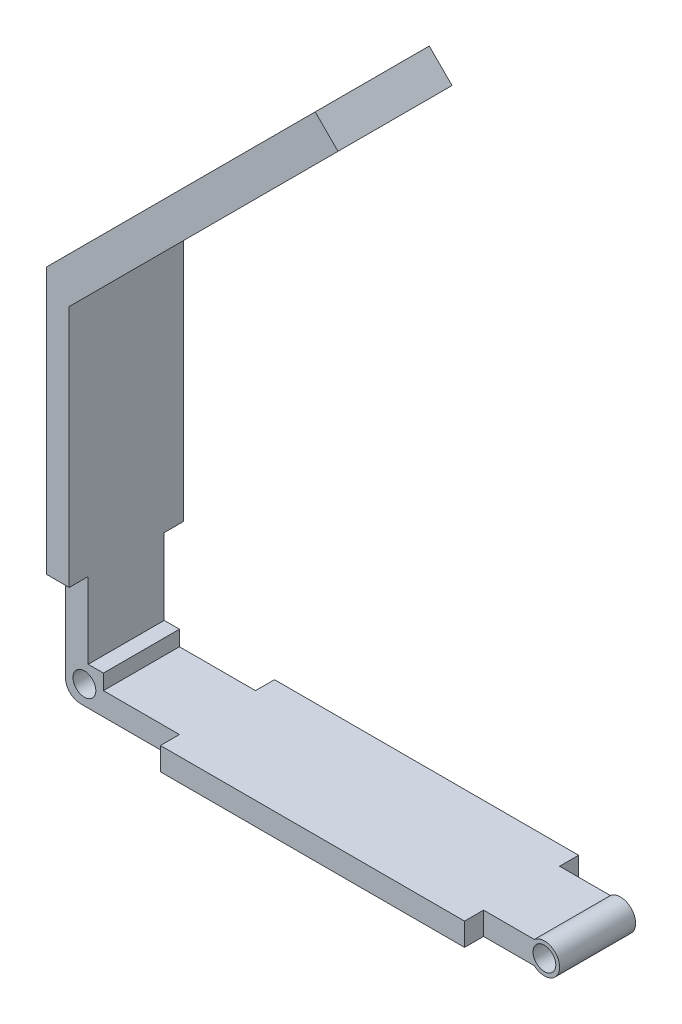
ISO-10303-21;
HEADER;
FILE_DESCRIPTION(('STEP AP214'),'2;1');
FILE_NAME('part.step','',(''),(''),'','','');
FILE_SCHEMA(('AUTOMOTIVE_DESIGN { 1 0 10303 214 1 1 1 1 }'));
ENDSEC;
DATA;
#1=APPLICATION_CONTEXT('core data for automotive mechanical design processes');
#2=APPLICATION_PROTOCOL_DEFINITION('international standard','automotive_design',2000,#1);
#3=PRODUCT_CONTEXT('',#1,'mechanical');
#4=PRODUCT('Part','Part','',(#3));
#5=PRODUCT_RELATED_PRODUCT_CATEGORY('part','',(#4));
#6=PRODUCT_DEFINITION_FORMATION('','',#4);
#7=PRODUCT_DEFINITION_CONTEXT('part definition',#1,'design');
#8=PRODUCT_DEFINITION('design','',#6,#7);
#9=PRODUCT_DEFINITION_SHAPE('','',#8);
#10=(LENGTH_UNIT() NAMED_UNIT(*) SI_UNIT(.MILLI.,.METRE.));
#11=(NAMED_UNIT(*) PLANE_ANGLE_UNIT() SI_UNIT($,.RADIAN.));
#12=(NAMED_UNIT(*) SI_UNIT($,.STERADIAN.) SOLID_ANGLE_UNIT());
#13=UNCERTAINTY_MEASURE_WITH_UNIT(LENGTH_MEASURE(1.E-05),#10,'distance_accuracy_value','');
#14=(GEOMETRIC_REPRESENTATION_CONTEXT(3) GLOBAL_UNCERTAINTY_ASSIGNED_CONTEXT((#13)) GLOBAL_UNIT_ASSIGNED_CONTEXT((#10,
#11,#12)) REPRESENTATION_CONTEXT('',''));
#15=CARTESIAN_POINT('',(0.,0.,0.));
#16=DIRECTION('',(0.,0.,1.));
#17=DIRECTION('',(1.,0.,0.));
#18=AXIS2_PLACEMENT_3D('',#15,#16,#17);
#19=CARTESIAN_POINT('',(0.,0.,0.));
#20=DIRECTION('',(1.,0.,0.));
#21=DIRECTION('',(0.,0.,-1.));
#22=AXIS2_PLACEMENT_3D('',#19,#20,#21);
#23=PLANE('',#22);
#24=DIRECTION('',(0.,-1.,0.));
#25=VECTOR('',#24,1.);
#26=CARTESIAN_POINT('',(0.,0.,-15.));
#27=LINE('',#26,#25);
#28=CARTESIAN_POINT('',(0.,47.,-15.));
#29=VERTEX_POINT('',#28);
#30=CARTESIAN_POINT('',(0.,15.,-15.));
#31=VERTEX_POINT('',#30);
#32=EDGE_CURVE('E402',#29,#31,#27,.T.);
#33=ORIENTED_EDGE('',*,*,#32,.F.);
#34=DIRECTION('',(0.,0.,-1.));
#35=VECTOR('',#34,1.);
#36=CARTESIAN_POINT('',(0.,47.,-15.));
#37=LINE('',#36,#35);
#38=CARTESIAN_POINT('',(0.,47.,0.));
#39=VERTEX_POINT('',#38);
#40=EDGE_CURVE('E218',#39,#29,#37,.T.);
#41=ORIENTED_EDGE('',*,*,#40,.F.);
#42=DIRECTION('',(0.,1.,0.));
#43=VECTOR('',#42,1.);
#44=CARTESIAN_POINT('',(0.,0.,0.));
#45=LINE('',#44,#43);
#46=CARTESIAN_POINT('',(0.,15.,0.));
#47=VERTEX_POINT('',#46);
#48=EDGE_CURVE('E408',#47,#39,#45,.T.);
#49=ORIENTED_EDGE('',*,*,#48,.F.);
#50=DIRECTION('',(0.,0.,-1.));
#51=VECTOR('',#50,1.);
#52=CARTESIAN_POINT('',(0.,15.,0.));
#53=LINE('',#52,#51);
#54=CARTESIAN_POINT('',(0.,15.,-2.5));
#55=VERTEX_POINT('',#54);
#56=EDGE_CURVE('E329',#47,#55,#53,.T.);
#57=ORIENTED_EDGE('',*,*,#56,.T.);
#58=DIRECTION('',(0.,-1.,0.));
#59=VECTOR('',#58,1.);
#60=CARTESIAN_POINT('',(0.,0.,-2.5));
#61=LINE('',#60,#59);
#62=CARTESIAN_POINT('',(0.,5.,-2.5));
#63=VERTEX_POINT('',#62);
#64=EDGE_CURVE('E304',#55,#63,#61,.T.);
#65=ORIENTED_EDGE('',*,*,#64,.T.);
#66=DIRECTION('',(0.,0.,1.));
#67=VECTOR('',#66,1.);
#68=CARTESIAN_POINT('',(0.,5.,0.));
#69=LINE('',#68,#67);
#70=CARTESIAN_POINT('',(0.,5.,-12.5));
#71=VERTEX_POINT('',#70);
#72=EDGE_CURVE('E394',#71,#63,#69,.T.);
#73=ORIENTED_EDGE('',*,*,#72,.F.);
#74=DIRECTION('',(0.,1.,0.));
#75=VECTOR('',#74,1.);
#76=CARTESIAN_POINT('',(0.,0.,-12.5));
#77=LINE('',#76,#75);
#78=CARTESIAN_POINT('',(0.,15.,-12.5));
#79=VERTEX_POINT('',#78);
#80=EDGE_CURVE('E377',#71,#79,#77,.T.);
#81=ORIENTED_EDGE('',*,*,#80,.T.);
#82=DIRECTION('',(0.,0.,1.));
#83=VECTOR('',#82,1.);
#84=CARTESIAN_POINT('',(0.,15.,0.));
#85=LINE('',#84,#83);
#86=EDGE_CURVE('E384',#31,#79,#85,.T.);
#87=ORIENTED_EDGE('',*,*,#86,.F.);
#88=EDGE_LOOP('',(#33,#41,#49,#57,#65,#73,#81,#87));
#89=FACE_BOUND('',#88,.T.);
#90=ADVANCED_FACE('F39',(#89),#23,.T.);
#91=CARTESIAN_POINT('',(60.,1.5,5.65685424949239));
#92=DIRECTION('',(0.,0.,-1.));
#93=DIRECTION('',(-1.,0.,0.));
#94=AXIS2_PLACEMENT_3D('',#91,#92,#93);
#95=CYLINDRICAL_SURFACE('',#94,2.);
#96=CARTESIAN_POINT('',(60.,1.5,-2.5));
#97=DIRECTION('',(0.,0.,1.));
#98=DIRECTION('',(1.,0.,0.));
#99=AXIS2_PLACEMENT_3D('',#96,#97,#98);
#100=CIRCLE('',#99,2.);
#101=CARTESIAN_POINT('',(58.6771243444677,3.,-2.5));
#102=VERTEX_POINT('',#101);
#103=CARTESIAN_POINT('',(58.6771243444677,0.,-2.5));
#104=VERTEX_POINT('',#103);
#105=EDGE_CURVE('E236',#102,#104,#100,.F.);
#106=ORIENTED_EDGE('',*,*,#105,.T.);
#107=DIRECTION('',(0.,0.,-1.));
#108=VECTOR('',#107,1.);
#109=CARTESIAN_POINT('',(58.6771243444677,0.,5.65685424949239));
#110=LINE('',#109,#108);
#111=CARTESIAN_POINT('',(58.6771243444677,0.,-12.5));
#112=VERTEX_POINT('',#111);
#113=EDGE_CURVE('E277',#104,#112,#110,.T.);
#114=ORIENTED_EDGE('',*,*,#113,.T.);
#115=CARTESIAN_POINT('',(60.,1.5,-12.5));
#116=DIRECTION('',(0.,0.,-1.));
#117=DIRECTION('',(-1.,0.,0.));
#118=AXIS2_PLACEMENT_3D('',#115,#116,#117);
#119=CIRCLE('',#118,2.);
#120=CARTESIAN_POINT('',(58.6771243444677,3.,-12.5));
#121=VERTEX_POINT('',#120);
#122=EDGE_CURVE('E258',#112,#121,#119,.F.);
#123=ORIENTED_EDGE('',*,*,#122,.T.);
#124=DIRECTION('',(0.,0.,-1.));
#125=VECTOR('',#124,1.);
#126=CARTESIAN_POINT('',(58.6771243444677,3.,5.65685424949239));
#127=LINE('',#126,#125);
#128=EDGE_CURVE('E280',#102,#121,#127,.T.);
#129=ORIENTED_EDGE('',*,*,#128,.F.);
#130=EDGE_LOOP('',(#106,#114,#123,#129));
#131=FACE_BOUND('',#130,.T.);
#132=ADVANCED_FACE('F462',(#131),#95,.T.);
#133=CARTESIAN_POINT('',(60.,1.5,0.));
#134=DIRECTION('',(0.,0.,-1.));
#135=DIRECTION('',(-1.,0.,0.));
#136=AXIS2_PLACEMENT_3D('',#133,#134,#135);
#137=CYLINDRICAL_SURFACE('',#136,1.5);
#138=CARTESIAN_POINT('',(60.,1.5,-12.5));
#139=DIRECTION('',(0.,0.,-1.));
#140=DIRECTION('',(-1.,0.,0.));
#141=AXIS2_PLACEMENT_3D('',#138,#139,#140);
#142=CIRCLE('',#141,1.5);
#143=CARTESIAN_POINT('',(58.5,1.5,-12.5));
#144=VERTEX_POINT('',#143);
#145=EDGE_CURVE('E255',#144,#144,#142,.F.);
#146=ORIENTED_EDGE('',*,*,#145,.F.);
#147=EDGE_LOOP('',(#146));
#148=FACE_BOUND('',#147,.T.);
#149=CARTESIAN_POINT('',(60.,1.5,-2.5));
#150=DIRECTION('',(0.,0.,1.));
#151=DIRECTION('',(1.,0.,0.));
#152=AXIS2_PLACEMENT_3D('',#149,#150,#151);
#153=CIRCLE('',#152,1.5);
#154=CARTESIAN_POINT('',(61.5,1.5,-2.5));
#155=VERTEX_POINT('',#154);
#156=EDGE_CURVE('E243',#155,#155,#153,.F.);
#157=ORIENTED_EDGE('',*,*,#156,.F.);
#158=EDGE_LOOP('',(#157));
#159=FACE_BOUND('',#158,.T.);
#160=ADVANCED_FACE('F540',(#148,#159),#137,.F.);
#161=CARTESIAN_POINT('',(0.,3.,0.));
#162=DIRECTION('',(0.,0.,-1.));
#163=DIRECTION('',(-1.,0.,0.));
#164=AXIS2_PLACEMENT_3D('',#161,#162,#163);
#165=PLANE('',#164);
#166=DIRECTION('',(0.,1.,0.));
#167=VECTOR('',#166,1.);
#168=CARTESIAN_POINT('',(52.,3.50000000000001,0.));
#169=LINE('',#168,#167);
#170=CARTESIAN_POINT('',(52.,0.,0.));
#171=VERTEX_POINT('',#170);
#172=CARTESIAN_POINT('',(52.,3.,0.));
#173=VERTEX_POINT('',#172);
#174=EDGE_CURVE('E225',#171,#173,#169,.T.);
#175=ORIENTED_EDGE('',*,*,#174,.T.);
#176=DIRECTION('',(1.,0.,0.));
#177=VECTOR('',#176,1.);
#178=CARTESIAN_POINT('',(0.,3.,0.));
#179=LINE('',#178,#177);
#180=CARTESIAN_POINT('',(12.,3.,0.));
#181=VERTEX_POINT('',#180);
#182=EDGE_CURVE('E418',#181,#173,#179,.T.);
#183=ORIENTED_EDGE('',*,*,#182,.F.);
#184=DIRECTION('',(0.,-1.,0.));
#185=VECTOR('',#184,1.);
#186=CARTESIAN_POINT('',(12.,0.,0.));
#187=LINE('',#186,#185);
#188=CARTESIAN_POINT('',(12.,0.,0.));
#189=VERTEX_POINT('',#188);
#190=EDGE_CURVE('E283',#181,#189,#187,.T.);
#191=ORIENTED_EDGE('',*,*,#190,.T.);
#192=DIRECTION('',(1.,0.,0.));
#193=VECTOR('',#192,1.);
#194=CARTESIAN_POINT('',(0.,0.,0.));
#195=LINE('',#194,#193);
#196=EDGE_CURVE('E413',#189,#171,#195,.T.);
#197=ORIENTED_EDGE('',*,*,#196,.T.);
#198=EDGE_LOOP('',(#175,#183,#191,#197));
#199=FACE_BOUND('',#198,.T.);
#200=ADVANCED_FACE('F520',(#199),#165,.F.);
#201=CARTESIAN_POINT('',(0.,3.,0.));
#202=DIRECTION('',(0.,-1.,0.));
#203=DIRECTION('',(0.,0.,-1.));
#204=AXIS2_PLACEMENT_3D('',#201,#202,#203);
#205=PLANE('',#204);
#206=DIRECTION('',(0.,0.,1.));
#207=VECTOR('',#206,1.);
#208=CARTESIAN_POINT('',(52.,3.,0.));
#209=LINE('',#208,#207);
#210=CARTESIAN_POINT('',(52.,3.,-2.5));
#211=VERTEX_POINT('',#210);
#212=EDGE_CURVE('E247',#211,#173,#209,.T.);
#213=ORIENTED_EDGE('',*,*,#212,.F.);
#214=DIRECTION('',(-1.,0.,0.));
#215=VECTOR('',#214,1.);
#216=CARTESIAN_POINT('',(0.,3.,-2.5));
#217=LINE('',#216,#215);
#218=EDGE_CURVE('E240',#102,#211,#217,.T.);
#219=ORIENTED_EDGE('',*,*,#218,.F.);
#220=ORIENTED_EDGE('',*,*,#128,.T.);
#221=DIRECTION('',(1.,0.,0.));
#222=VECTOR('',#221,1.);
#223=CARTESIAN_POINT('',(0.,3.,-12.5));
#224=LINE('',#223,#222);
#225=CARTESIAN_POINT('',(52.,3.,-12.5));
#226=VERTEX_POINT('',#225);
#227=EDGE_CURVE('E266',#226,#121,#224,.T.);
#228=ORIENTED_EDGE('',*,*,#227,.F.);
#229=DIRECTION('',(0.,0.,-1.));
#230=VECTOR('',#229,1.);
#231=CARTESIAN_POINT('',(52.,3.,0.));
#232=LINE('',#231,#230);
#233=CARTESIAN_POINT('',(52.,3.,-15.));
#234=VERTEX_POINT('',#233);
#235=EDGE_CURVE('E273',#226,#234,#232,.T.);
#236=ORIENTED_EDGE('',*,*,#235,.T.);
#237=DIRECTION('',(-1.,0.,0.));
#238=VECTOR('',#237,1.);
#239=CARTESIAN_POINT('',(0.,3.,-15.));
#240=LINE('',#239,#238);
#241=CARTESIAN_POINT('',(12.,3.,-15.));
#242=VERTEX_POINT('',#241);
#243=EDGE_CURVE('E422',#234,#242,#240,.T.);
#244=ORIENTED_EDGE('',*,*,#243,.T.);
#245=DIRECTION('',(0.,0.,1.));
#246=VECTOR('',#245,1.);
#247=CARTESIAN_POINT('',(12.,3.,0.));
#248=LINE('',#247,#246);
#249=CARTESIAN_POINT('',(12.,3.,-12.5));
#250=VERTEX_POINT('',#249);
#251=EDGE_CURVE('E387',#242,#250,#248,.T.);
#252=ORIENTED_EDGE('',*,*,#251,.T.);
#253=DIRECTION('',(1.,0.,0.));
#254=VECTOR('',#253,1.);
#255=CARTESIAN_POINT('',(0.,3.,-12.5));
#256=LINE('',#255,#254);
#257=CARTESIAN_POINT('',(2.,3.,-12.5));
#258=VERTEX_POINT('',#257);
#259=EDGE_CURVE('E381',#258,#250,#256,.T.);
#260=ORIENTED_EDGE('',*,*,#259,.F.);
#261=DIRECTION('',(0.,0.,1.));
#262=VECTOR('',#261,1.);
#263=CARTESIAN_POINT('',(2.,3.,0.));
#264=LINE('',#263,#262);
#265=CARTESIAN_POINT('',(2.,3.,-2.5));
#266=VERTEX_POINT('',#265);
#267=EDGE_CURVE('E398',#258,#266,#264,.T.);
#268=ORIENTED_EDGE('',*,*,#267,.T.);
#269=DIRECTION('',(-1.,0.,0.));
#270=VECTOR('',#269,1.);
#271=CARTESIAN_POINT('',(0.,3.,-2.5));
#272=LINE('',#271,#270);
#273=CARTESIAN_POINT('',(12.,3.,-2.5));
#274=VERTEX_POINT('',#273);
#275=EDGE_CURVE('E318',#274,#266,#272,.T.);
#276=ORIENTED_EDGE('',*,*,#275,.F.);
#277=DIRECTION('',(0.,0.,-1.));
#278=VECTOR('',#277,1.);
#279=CARTESIAN_POINT('',(12.,3.,0.));
#280=LINE('',#279,#278);
#281=EDGE_CURVE('E333',#181,#274,#280,.T.);
#282=ORIENTED_EDGE('',*,*,#281,.F.);
#283=ORIENTED_EDGE('',*,*,#182,.T.);
#284=EDGE_LOOP('',(#213,#219,#220,#228,#236,#244,#252,#260,#268,#276,#282,#283));
#285=FACE_BOUND('',#284,.T.);
#286=ADVANCED_FACE('F460',(#285),#205,.F.);
#287=CARTESIAN_POINT('',(0.,0.,0.));
#288=DIRECTION('',(0.,-1.,0.));
#289=DIRECTION('',(0.,0.,-1.));
#290=AXIS2_PLACEMENT_3D('',#287,#288,#289);
#291=PLANE('',#290);
#292=DIRECTION('',(-1.,0.,0.));
#293=VECTOR('',#292,1.);
#294=CARTESIAN_POINT('',(0.,0.,-2.5));
#295=LINE('',#294,#293);
#296=CARTESIAN_POINT('',(52.,0.,-2.5));
#297=VERTEX_POINT('',#296);
#298=EDGE_CURVE('E48',#104,#297,#295,.T.);
#299=ORIENTED_EDGE('',*,*,#298,.T.);
#300=DIRECTION('',(0.,0.,1.));
#301=VECTOR('',#300,1.);
#302=CARTESIAN_POINT('',(52.,0.,0.));
#303=LINE('',#302,#301);
#304=EDGE_CURVE('E11',#297,#171,#303,.T.);
#305=ORIENTED_EDGE('',*,*,#304,.T.);
#306=ORIENTED_EDGE('',*,*,#196,.F.);
#307=DIRECTION('',(0.,0.,1.));
#308=VECTOR('',#307,1.);
#309=CARTESIAN_POINT('',(12.,0.,-2.5));
#310=LINE('',#309,#308);
#311=CARTESIAN_POINT('',(12.,0.,-2.5));
#312=VERTEX_POINT('',#311);
#313=EDGE_CURVE('E295',#312,#189,#310,.T.);
#314=ORIENTED_EDGE('',*,*,#313,.F.);
#315=DIRECTION('',(-1.,0.,0.));
#316=VECTOR('',#315,1.);
#317=CARTESIAN_POINT('',(-3.,0.,-2.5));
#318=LINE('',#317,#316);
#319=CARTESIAN_POINT('',(-1.,0.,-2.5));
#320=VERTEX_POINT('',#319);
#321=EDGE_CURVE('E284',#312,#320,#318,.T.);
#322=ORIENTED_EDGE('',*,*,#321,.T.);
#323=DIRECTION('',(0.,0.,1.));
#324=VECTOR('',#323,1.);
#325=CARTESIAN_POINT('',(-1.,0.,-15.));
#326=LINE('',#325,#324);
#327=CARTESIAN_POINT('',(-1.,0.,-12.5));
#328=VERTEX_POINT('',#327);
#329=EDGE_CURVE('E435',#320,#328,#326,.F.);
#330=ORIENTED_EDGE('',*,*,#329,.T.);
#331=DIRECTION('',(-1.,0.,0.));
#332=VECTOR('',#331,1.);
#333=CARTESIAN_POINT('',(-3.,0.,-12.5));
#334=LINE('',#333,#332);
#335=CARTESIAN_POINT('',(12.,0.,-12.5));
#336=VERTEX_POINT('',#335);
#337=EDGE_CURVE('E348',#336,#328,#334,.T.);
#338=ORIENTED_EDGE('',*,*,#337,.F.);
#339=DIRECTION('',(0.,0.,-1.));
#340=VECTOR('',#339,1.);
#341=CARTESIAN_POINT('',(12.,0.,-12.5));
#342=LINE('',#341,#340);
#343=CARTESIAN_POINT('',(12.,0.,-15.));
#344=VERTEX_POINT('',#343);
#345=EDGE_CURVE('E359',#336,#344,#342,.T.);
#346=ORIENTED_EDGE('',*,*,#345,.T.);
#347=DIRECTION('',(-1.,0.,0.));
#348=VECTOR('',#347,1.);
#349=CARTESIAN_POINT('',(0.,0.,-15.));
#350=LINE('',#349,#348);
#351=CARTESIAN_POINT('',(52.,0.,-15.));
#352=VERTEX_POINT('',#351);
#353=EDGE_CURVE('E423',#352,#344,#350,.T.);
#354=ORIENTED_EDGE('',*,*,#353,.F.);
#355=DIRECTION('',(0.,0.,-1.));
#356=VECTOR('',#355,1.);
#357=CARTESIAN_POINT('',(52.,0.,0.));
#358=LINE('',#357,#356);
#359=CARTESIAN_POINT('',(52.,0.,-12.5));
#360=VERTEX_POINT('',#359);
#361=EDGE_CURVE('E270',#360,#352,#358,.T.);
#362=ORIENTED_EDGE('',*,*,#361,.F.);
#363=DIRECTION('',(1.,0.,0.));
#364=VECTOR('',#363,1.);
#365=CARTESIAN_POINT('',(0.,0.,-12.5));
#366=LINE('',#365,#364);
#367=EDGE_CURVE('E262',#360,#112,#366,.T.);
#368=ORIENTED_EDGE('',*,*,#367,.T.);
#369=ORIENTED_EDGE('',*,*,#113,.F.);
#370=EDGE_LOOP('',(#299,#305,#306,#314,#322,#330,#338,#346,#354,#362,#368,#369));
#371=FACE_BOUND('',#370,.T.);
#372=ADVANCED_FACE('F451',(#371),#291,.T.);
#373=CARTESIAN_POINT('',(2.,0.,0.));
#374=DIRECTION('',(1.,0.,0.));
#375=DIRECTION('',(0.,0.,-1.));
#376=AXIS2_PLACEMENT_3D('',#373,#374,#375);
#377=PLANE('',#376);
#378=DIRECTION('',(0.,0.,-1.));
#379=VECTOR('',#378,1.);
#380=CARTESIAN_POINT('',(2.,5.,0.));
#381=LINE('',#380,#379);
#382=CARTESIAN_POINT('',(2.,5.,-2.5));
#383=VERTEX_POINT('',#382);
#384=CARTESIAN_POINT('',(2.,5.,-12.5));
#385=VERTEX_POINT('',#384);
#386=EDGE_CURVE('E391',#383,#385,#381,.T.);
#387=ORIENTED_EDGE('',*,*,#386,.F.);
#388=DIRECTION('',(0.,-1.,0.));
#389=VECTOR('',#388,1.);
#390=CARTESIAN_POINT('',(2.,0.,-2.5));
#391=LINE('',#390,#389);
#392=EDGE_CURVE('E314',#383,#266,#391,.T.);
#393=ORIENTED_EDGE('',*,*,#392,.T.);
#394=ORIENTED_EDGE('',*,*,#267,.F.);
#395=DIRECTION('',(0.,1.,0.));
#396=VECTOR('',#395,1.);
#397=CARTESIAN_POINT('',(2.,0.,-12.5));
#398=LINE('',#397,#396);
#399=EDGE_CURVE('E373',#258,#385,#398,.T.);
#400=ORIENTED_EDGE('',*,*,#399,.T.);
#401=EDGE_LOOP('',(#387,#393,#394,#400));
#402=FACE_BOUND('',#401,.T.);
#403=ADVANCED_FACE('F505',(#402),#377,.T.);
#404=CARTESIAN_POINT('',(-3.,5.,0.));
#405=DIRECTION('',(0.,1.,0.));
#406=DIRECTION('',(0.,0.,1.));
#407=AXIS2_PLACEMENT_3D('',#404,#405,#406);
#408=PLANE('',#407);
#409=ORIENTED_EDGE('',*,*,#72,.T.);
#410=DIRECTION('',(1.,0.,0.));
#411=VECTOR('',#410,1.);
#412=CARTESIAN_POINT('',(-3.,5.,-2.5));
#413=LINE('',#412,#411);
#414=EDGE_CURVE('E310',#63,#383,#413,.T.);
#415=ORIENTED_EDGE('',*,*,#414,.T.);
#416=ORIENTED_EDGE('',*,*,#386,.T.);
#417=DIRECTION('',(-1.,0.,0.));
#418=VECTOR('',#417,1.);
#419=CARTESIAN_POINT('',(-3.,5.,-12.5));
#420=LINE('',#419,#418);
#421=EDGE_CURVE('E369',#385,#71,#420,.T.);
#422=ORIENTED_EDGE('',*,*,#421,.T.);
#423=EDGE_LOOP('',(#409,#415,#416,#422));
#424=FACE_BOUND('',#423,.T.);
#425=ADVANCED_FACE('F502',(#424),#408,.T.);
#426=CARTESIAN_POINT('',(-0.5,2.5,0.));
#427=DIRECTION('',(0.,0.,-1.));
#428=DIRECTION('',(-1.,0.,0.));
#429=AXIS2_PLACEMENT_3D('',#426,#427,#428);
#430=CYLINDRICAL_SURFACE('',#429,1.5);
#431=CARTESIAN_POINT('',(-0.5,2.5,-12.5));
#432=DIRECTION('',(0.,0.,-1.));
#433=DIRECTION('',(-1.,0.,0.));
#434=AXIS2_PLACEMENT_3D('',#431,#432,#433);
#435=CIRCLE('',#434,1.5);
#436=CARTESIAN_POINT('',(-2.,2.5,-12.5));
#437=VERTEX_POINT('',#436);
#438=EDGE_CURVE('E363',#437,#437,#435,.F.);
#439=ORIENTED_EDGE('',*,*,#438,.F.);
#440=EDGE_LOOP('',(#439));
#441=FACE_BOUND('',#440,.T.);
#442=CARTESIAN_POINT('',(-0.5,2.5,-2.5));
#443=DIRECTION('',(0.,0.,1.));
#444=DIRECTION('',(1.,0.,0.));
#445=AXIS2_PLACEMENT_3D('',#442,#443,#444);
#446=CIRCLE('',#445,1.5);
#447=CARTESIAN_POINT('',(1.,2.5,-2.5));
#448=VERTEX_POINT('',#447);
#449=EDGE_CURVE('E325',#448,#448,#446,.F.);
#450=ORIENTED_EDGE('',*,*,#449,.F.);
#451=EDGE_LOOP('',(#450));
#452=FACE_BOUND('',#451,.T.);
#453=ADVANCED_FACE('F556',(#441,#452),#430,.F.);
#454=CARTESIAN_POINT('',(-1.,2.,0.));
#455=DIRECTION('',(0.,0.,-1.));
#456=DIRECTION('',(-1.,0.,0.));
#457=AXIS2_PLACEMENT_3D('',#454,#455,#456);
#458=CYLINDRICAL_SURFACE('',#457,2.);
#459=ORIENTED_EDGE('',*,*,#329,.F.);
#460=CARTESIAN_POINT('',(-1.,2.,-2.5));
#461=DIRECTION('',(0.,0.,1.));
#462=DIRECTION('',(1.,0.,0.));
#463=AXIS2_PLACEMENT_3D('',#460,#461,#462);
#464=CIRCLE('',#463,2.);
#465=CARTESIAN_POINT('',(-3.,2.,-2.5));
#466=VERTEX_POINT('',#465);
#467=EDGE_CURVE('E321',#320,#466,#464,.F.);
#468=ORIENTED_EDGE('',*,*,#467,.T.);
#469=DIRECTION('',(0.,0.,1.));
#470=VECTOR('',#469,1.);
#471=CARTESIAN_POINT('',(-3.,2.,0.));
#472=LINE('',#471,#470);
#473=CARTESIAN_POINT('',(-3.,2.,-12.5));
#474=VERTEX_POINT('',#473);
#475=EDGE_CURVE('E426',#474,#466,#472,.T.);
#476=ORIENTED_EDGE('',*,*,#475,.F.);
#477=CARTESIAN_POINT('',(-1.,2.,-12.5));
#478=DIRECTION('',(0.,0.,-1.));
#479=DIRECTION('',(-1.,0.,0.));
#480=AXIS2_PLACEMENT_3D('',#477,#478,#479);
#481=CIRCLE('',#480,2.);
#482=EDGE_CURVE('E438',#474,#328,#481,.F.);
#483=ORIENTED_EDGE('',*,*,#482,.T.);
#484=EDGE_LOOP('',(#459,#468,#476,#483));
#485=FACE_BOUND('',#484,.T.);
#486=ADVANCED_FACE('F41',(#485),#458,.T.);
#487=DIRECTION('',(-0.707106781186548,-0.707106781186548,0.));
#488=VECTOR('',#487,1.);
#489=CARTESIAN_POINT('',(32.3553390593274,85.3553390593274,0.));
#490=LINE('',#489,#488);
#491=CARTESIAN_POINT('',(32.3553390593274,85.3553390593274,0.));
#492=VERTEX_POINT('',#491);
#493=CARTESIAN_POINT('',(-2.99999999999999,50.,0.));
#494=VERTEX_POINT('',#493);
#495=EDGE_CURVE('E201',#492,#494,#490,.T.);
#496=ORIENTED_EDGE('',*,*,#495,.T.);
#497=DIRECTION('',(0.,1.,0.));
#498=VECTOR('',#497,1.);
#499=CARTESIAN_POINT('',(-3.,0.,0.));
#500=LINE('',#499,#498);
#501=CARTESIAN_POINT('',(-3.,15.,0.));
#502=VERTEX_POINT('',#501);
#503=EDGE_CURVE('E407',#502,#494,#500,.T.);
#504=ORIENTED_EDGE('',*,*,#503,.F.);
#505=DIRECTION('',(1.,0.,0.));
#506=VECTOR('',#505,1.);
#507=CARTESIAN_POINT('',(-3.,15.,0.));
#508=LINE('',#507,#506);
#509=EDGE_CURVE('E289',#502,#47,#508,.T.);
#510=ORIENTED_EDGE('',*,*,#509,.T.);
#511=ORIENTED_EDGE('',*,*,#48,.T.);
#512=DIRECTION('',(-0.707106781186548,-0.707106781186548,0.));
#513=VECTOR('',#512,1.);
#514=CARTESIAN_POINT('',(35.3553390593274,82.3553390593274,0.));
#515=LINE('',#514,#513);
#516=CARTESIAN_POINT('',(35.3553390593274,82.3553390593274,0.));
#517=VERTEX_POINT('',#516);
#518=EDGE_CURVE('E204',#517,#39,#515,.T.);
#519=ORIENTED_EDGE('',*,*,#518,.F.);
#520=DIRECTION('',(0.707106781186547,-0.707106781186548,0.));
#521=VECTOR('',#520,1.);
#522=CARTESIAN_POINT('',(32.3553390593274,85.3553390593274,0.));
#523=LINE('',#522,#521);
#524=EDGE_CURVE('E196',#492,#517,#523,.T.);
#525=ORIENTED_EDGE('',*,*,#524,.F.);
#526=EDGE_LOOP('',(#496,#504,#510,#511,#519,#525));
#527=FACE_BOUND('',#526,.T.);
#528=ADVANCED_FACE('F198',(#527),#165,.F.);
#529=CARTESIAN_POINT('',(-3.,0.,0.));
#530=DIRECTION('',(1.,0.,0.));
#531=DIRECTION('',(0.,0.,-1.));
#532=AXIS2_PLACEMENT_3D('',#529,#530,#531);
#533=PLANE('',#532);
#534=DIRECTION('',(0.,0.,1.));
#535=VECTOR('',#534,1.);
#536=CARTESIAN_POINT('',(-3.,15.,-2.5));
#537=LINE('',#536,#535);
#538=CARTESIAN_POINT('',(-3.,15.,-2.5));
#539=VERTEX_POINT('',#538);
#540=EDGE_CURVE('E63',#539,#502,#537,.T.);
#541=ORIENTED_EDGE('',*,*,#540,.T.);
#542=ORIENTED_EDGE('',*,*,#503,.T.);
#543=DIRECTION('',(0.,0.,-1.));
#544=VECTOR('',#543,1.);
#545=CARTESIAN_POINT('',(-3.,50.,-15.));
#546=LINE('',#545,#544);
#547=CARTESIAN_POINT('',(-3.,50.,-15.));
#548=VERTEX_POINT('',#547);
#549=EDGE_CURVE('E222',#494,#548,#546,.T.);
#550=ORIENTED_EDGE('',*,*,#549,.T.);
#551=DIRECTION('',(0.,-1.,0.));
#552=VECTOR('',#551,1.);
#553=CARTESIAN_POINT('',(-3.,0.,-15.));
#554=LINE('',#553,#552);
#555=CARTESIAN_POINT('',(-3.,15.,-15.));
#556=VERTEX_POINT('',#555);
#557=EDGE_CURVE('E403',#548,#556,#554,.T.);
#558=ORIENTED_EDGE('',*,*,#557,.T.);
#559=DIRECTION('',(0.,0.,-1.));
#560=VECTOR('',#559,1.);
#561=CARTESIAN_POINT('',(-3.,15.,-12.5));
#562=LINE('',#561,#560);
#563=CARTESIAN_POINT('',(-3.,15.,-12.5));
#564=VERTEX_POINT('',#563);
#565=EDGE_CURVE('E352',#564,#556,#562,.T.);
#566=ORIENTED_EDGE('',*,*,#565,.F.);
#567=DIRECTION('',(0.,1.,0.));
#568=VECTOR('',#567,1.);
#569=CARTESIAN_POINT('',(-3.,0.,-12.5));
#570=LINE('',#569,#568);
#571=EDGE_CURVE('E337',#474,#564,#570,.T.);
#572=ORIENTED_EDGE('',*,*,#571,.F.);
#573=ORIENTED_EDGE('',*,*,#475,.T.);
#574=DIRECTION('',(0.,-1.,0.));
#575=VECTOR('',#574,1.);
#576=CARTESIAN_POINT('',(-3.,0.,-2.5));
#577=LINE('',#576,#575);
#578=EDGE_CURVE('E442',#539,#466,#577,.T.);
#579=ORIENTED_EDGE('',*,*,#578,.F.);
#580=EDGE_LOOP('',(#541,#542,#550,#558,#566,#572,#573,#579));
#581=FACE_BOUND('',#580,.T.);
#582=ADVANCED_FACE('F489',(#581),#533,.F.);
#583=CARTESIAN_POINT('',(0.,3.,-15.));
#584=DIRECTION('',(0.,0.,1.));
#585=DIRECTION('',(1.,0.,0.));
#586=AXIS2_PLACEMENT_3D('',#583,#584,#585);
#587=PLANE('',#586);
#588=ORIENTED_EDGE('',*,*,#243,.F.);
#589=DIRECTION('',(0.,1.,0.));
#590=VECTOR('',#589,1.);
#591=CARTESIAN_POINT('',(52.,3.50000000000001,-15.));
#592=LINE('',#591,#590);
#593=EDGE_CURVE('E250',#352,#234,#592,.T.);
#594=ORIENTED_EDGE('',*,*,#593,.F.);
#595=ORIENTED_EDGE('',*,*,#353,.T.);
#596=DIRECTION('',(0.,-1.,0.));
#597=VECTOR('',#596,1.);
#598=CARTESIAN_POINT('',(12.,0.,-15.));
#599=LINE('',#598,#597);
#600=EDGE_CURVE('E341',#242,#344,#599,.T.);
#601=ORIENTED_EDGE('',*,*,#600,.F.);
#602=EDGE_LOOP('',(#588,#594,#595,#601));
#603=FACE_BOUND('',#602,.T.);
#604=ADVANCED_FACE('F473',(#603),#587,.F.);
#605=DIRECTION('',(-0.707106781186548,-0.707106781186548,0.));
#606=VECTOR('',#605,1.);
#607=CARTESIAN_POINT('',(35.3553390593274,82.3553390593274,-15.));
#608=LINE('',#607,#606);
#609=CARTESIAN_POINT('',(35.3553390593274,82.3553390593274,-15.));
#610=VERTEX_POINT('',#609);
#611=EDGE_CURVE('E231',#610,#29,#608,.T.);
#612=ORIENTED_EDGE('',*,*,#611,.T.);
#613=ORIENTED_EDGE('',*,*,#32,.T.);
#614=DIRECTION('',(1.,0.,0.));
#615=VECTOR('',#614,1.);
#616=CARTESIAN_POINT('',(-3.,15.,-15.));
#617=LINE('',#616,#615);
#618=EDGE_CURVE('E336',#556,#31,#617,.T.);
#619=ORIENTED_EDGE('',*,*,#618,.F.);
#620=ORIENTED_EDGE('',*,*,#557,.F.);
#621=DIRECTION('',(-0.707106781186548,-0.707106781186548,0.));
#622=VECTOR('',#621,1.);
#623=CARTESIAN_POINT('',(32.3553390593274,85.3553390593274,-15.));
#624=LINE('',#623,#622);
#625=CARTESIAN_POINT('',(32.3553390593274,85.3553390593274,-15.));
#626=VERTEX_POINT('',#625);
#627=EDGE_CURVE('E732',#626,#548,#624,.T.);
#628=ORIENTED_EDGE('',*,*,#627,.F.);
#629=DIRECTION('',(-0.707106781186547,0.707106781186548,0.));
#630=VECTOR('',#629,1.);
#631=CARTESIAN_POINT('',(32.3553390593274,85.3553390593274,-15.));
#632=LINE('',#631,#630);
#633=EDGE_CURVE('E214',#610,#626,#632,.T.);
#634=ORIENTED_EDGE('',*,*,#633,.F.);
#635=EDGE_LOOP('',(#612,#613,#619,#620,#628,#634));
#636=FACE_BOUND('',#635,.T.);
#637=ADVANCED_FACE('F549',(#636),#587,.F.);
#638=CARTESIAN_POINT('',(12.,0.,-12.5));
#639=DIRECTION('',(1.,0.,0.));
#640=DIRECTION('',(0.,0.,-1.));
#641=AXIS2_PLACEMENT_3D('',#638,#639,#640);
#642=PLANE('',#641);
#643=ORIENTED_EDGE('',*,*,#600,.T.);
#644=ORIENTED_EDGE('',*,*,#345,.F.);
#645=DIRECTION('',(0.,-1.,0.));
#646=VECTOR('',#645,1.);
#647=CARTESIAN_POINT('',(12.,0.,-12.5));
#648=LINE('',#647,#646);
#649=EDGE_CURVE('E345',#250,#336,#648,.T.);
#650=ORIENTED_EDGE('',*,*,#649,.F.);
#651=ORIENTED_EDGE('',*,*,#251,.F.);
#652=EDGE_LOOP('',(#643,#644,#650,#651));
#653=FACE_BOUND('',#652,.T.);
#654=ADVANCED_FACE('F477',(#653),#642,.F.);
#655=CARTESIAN_POINT('',(0.,0.,-12.5));
#656=DIRECTION('',(0.,0.,-1.));
#657=DIRECTION('',(-1.,0.,0.));
#658=AXIS2_PLACEMENT_3D('',#655,#656,#657);
#659=PLANE('',#658);
#660=ORIENTED_EDGE('',*,*,#438,.T.);
#661=EDGE_LOOP('',(#660));
#662=FACE_BOUND('',#661,.T.);
#663=ORIENTED_EDGE('',*,*,#259,.T.);
#664=ORIENTED_EDGE('',*,*,#649,.T.);
#665=ORIENTED_EDGE('',*,*,#337,.T.);
#666=ORIENTED_EDGE('',*,*,#482,.F.);
#667=ORIENTED_EDGE('',*,*,#571,.T.);
#668=DIRECTION('',(1.,0.,0.));
#669=VECTOR('',#668,1.);
#670=CARTESIAN_POINT('',(-3.,15.,-12.5));
#671=LINE('',#670,#669);
#672=EDGE_CURVE('E340',#564,#79,#671,.T.);
#673=ORIENTED_EDGE('',*,*,#672,.T.);
#674=ORIENTED_EDGE('',*,*,#80,.F.);
#675=ORIENTED_EDGE('',*,*,#421,.F.);
#676=ORIENTED_EDGE('',*,*,#399,.F.);
#677=EDGE_LOOP('',(#663,#664,#665,#666,#667,#673,#674,#675,#676));
#678=FACE_BOUND('',#677,.T.);
#679=ADVANCED_FACE('F483',(#662,#678),#659,.T.);
#680=CARTESIAN_POINT('',(-3.,15.,-12.5));
#681=DIRECTION('',(0.,1.,0.));
#682=DIRECTION('',(0.,0.,1.));
#683=AXIS2_PLACEMENT_3D('',#680,#681,#682);
#684=PLANE('',#683);
#685=ORIENTED_EDGE('',*,*,#86,.T.);
#686=ORIENTED_EDGE('',*,*,#672,.F.);
#687=ORIENTED_EDGE('',*,*,#565,.T.);
#688=ORIENTED_EDGE('',*,*,#618,.T.);
#689=EDGE_LOOP('',(#685,#686,#687,#688));
#690=FACE_BOUND('',#689,.T.);
#691=ADVANCED_FACE('F493',(#690),#684,.F.);
#692=CARTESIAN_POINT('',(12.,0.,-2.5));
#693=DIRECTION('',(-1.,0.,0.));
#694=DIRECTION('',(0.,0.,1.));
#695=AXIS2_PLACEMENT_3D('',#692,#693,#694);
#696=PLANE('',#695);
#697=ORIENTED_EDGE('',*,*,#281,.T.);
#698=DIRECTION('',(0.,-1.,0.));
#699=VECTOR('',#698,1.);
#700=CARTESIAN_POINT('',(12.,0.,-2.5));
#701=LINE('',#700,#699);
#702=EDGE_CURVE('E288',#274,#312,#701,.T.);
#703=ORIENTED_EDGE('',*,*,#702,.T.);
#704=ORIENTED_EDGE('',*,*,#313,.T.);
#705=ORIENTED_EDGE('',*,*,#190,.F.);
#706=EDGE_LOOP('',(#697,#703,#704,#705));
#707=FACE_BOUND('',#706,.T.);
#708=ADVANCED_FACE('F518',(#707),#696,.T.);
#709=CARTESIAN_POINT('',(0.,0.,-2.5));
#710=DIRECTION('',(0.,0.,1.));
#711=DIRECTION('',(-1.,0.,0.));
#712=AXIS2_PLACEMENT_3D('',#709,#710,#711);
#713=PLANE('',#712);
#714=ORIENTED_EDGE('',*,*,#321,.F.);
#715=ORIENTED_EDGE('',*,*,#702,.F.);
#716=ORIENTED_EDGE('',*,*,#275,.T.);
#717=ORIENTED_EDGE('',*,*,#392,.F.);
#718=ORIENTED_EDGE('',*,*,#414,.F.);
#719=ORIENTED_EDGE('',*,*,#64,.F.);
#720=DIRECTION('',(1.,0.,0.));
#721=VECTOR('',#720,1.);
#722=CARTESIAN_POINT('',(-3.,15.,-2.5));
#723=LINE('',#722,#721);
#724=EDGE_CURVE('E292',#539,#55,#723,.T.);
#725=ORIENTED_EDGE('',*,*,#724,.F.);
#726=ORIENTED_EDGE('',*,*,#578,.T.);
#727=ORIENTED_EDGE('',*,*,#467,.F.);
#728=EDGE_LOOP('',(#714,#715,#716,#717,#718,#719,#725,#726,#727));
#729=FACE_BOUND('',#728,.T.);
#730=ORIENTED_EDGE('',*,*,#449,.T.);
#731=EDGE_LOOP('',(#730));
#732=FACE_BOUND('',#731,.T.);
#733=ADVANCED_FACE('F514',(#729,#732),#713,.T.);
#734=CARTESIAN_POINT('',(-3.,15.,-2.5));
#735=DIRECTION('',(0.,-1.,0.));
#736=DIRECTION('',(0.,0.,-1.));
#737=AXIS2_PLACEMENT_3D('',#734,#735,#736);
#738=PLANE('',#737);
#739=ORIENTED_EDGE('',*,*,#509,.F.);
#740=ORIENTED_EDGE('',*,*,#540,.F.);
#741=ORIENTED_EDGE('',*,*,#724,.T.);
#742=ORIENTED_EDGE('',*,*,#56,.F.);
#743=EDGE_LOOP('',(#739,#740,#741,#742));
#744=FACE_BOUND('',#743,.T.);
#745=ADVANCED_FACE('F572',(#744),#738,.T.);
#746=CARTESIAN_POINT('',(52.,3.50000000000001,-12.5));
#747=DIRECTION('',(-1.,0.,0.));
#748=DIRECTION('',(0.,0.,1.));
#749=AXIS2_PLACEMENT_3D('',#746,#747,#748);
#750=PLANE('',#749);
#751=DIRECTION('',(0.,1.,0.));
#752=VECTOR('',#751,1.);
#753=CARTESIAN_POINT('',(52.,3.50000000000001,-12.5));
#754=LINE('',#753,#752);
#755=EDGE_CURVE('E251',#360,#226,#754,.T.);
#756=ORIENTED_EDGE('',*,*,#755,.F.);
#757=ORIENTED_EDGE('',*,*,#361,.T.);
#758=ORIENTED_EDGE('',*,*,#593,.T.);
#759=ORIENTED_EDGE('',*,*,#235,.F.);
#760=EDGE_LOOP('',(#756,#757,#758,#759));
#761=FACE_BOUND('',#760,.T.);
#762=ADVANCED_FACE('F530',(#761),#750,.F.);
#763=CARTESIAN_POINT('',(0.,0.,-12.5));
#764=DIRECTION('',(0.,0.,-1.));
#765=DIRECTION('',(-1.,0.,0.));
#766=AXIS2_PLACEMENT_3D('',#763,#764,#765);
#767=PLANE('',#766);
#768=ORIENTED_EDGE('',*,*,#145,.T.);
#769=EDGE_LOOP('',(#768));
#770=FACE_BOUND('',#769,.T.);
#771=ORIENTED_EDGE('',*,*,#227,.T.);
#772=ORIENTED_EDGE('',*,*,#122,.F.);
#773=ORIENTED_EDGE('',*,*,#367,.F.);
#774=ORIENTED_EDGE('',*,*,#755,.T.);
#775=EDGE_LOOP('',(#771,#772,#773,#774));
#776=FACE_BOUND('',#775,.T.);
#777=ADVANCED_FACE('F465',(#770,#776),#767,.T.);
#778=CARTESIAN_POINT('',(52.,3.50000000000001,-2.5));
#779=DIRECTION('',(1.,0.,0.));
#780=DIRECTION('',(0.,0.,-1.));
#781=AXIS2_PLACEMENT_3D('',#778,#779,#780);
#782=PLANE('',#781);
#783=ORIENTED_EDGE('',*,*,#212,.T.);
#784=ORIENTED_EDGE('',*,*,#174,.F.);
#785=ORIENTED_EDGE('',*,*,#304,.F.);
#786=DIRECTION('',(0.,1.,0.));
#787=VECTOR('',#786,1.);
#788=CARTESIAN_POINT('',(52.,3.50000000000001,-2.5));
#789=LINE('',#788,#787);
#790=EDGE_CURVE('E55',#297,#211,#789,.T.);
#791=ORIENTED_EDGE('',*,*,#790,.T.);
#792=EDGE_LOOP('',(#783,#784,#785,#791));
#793=FACE_BOUND('',#792,.T.);
#794=ADVANCED_FACE('F522',(#793),#782,.T.);
#795=CARTESIAN_POINT('',(0.,0.,-2.5));
#796=DIRECTION('',(0.,0.,1.));
#797=DIRECTION('',(-1.,0.,0.));
#798=AXIS2_PLACEMENT_3D('',#795,#796,#797);
#799=PLANE('',#798);
#800=ORIENTED_EDGE('',*,*,#218,.T.);
#801=ORIENTED_EDGE('',*,*,#790,.F.);
#802=ORIENTED_EDGE('',*,*,#298,.F.);
#803=ORIENTED_EDGE('',*,*,#105,.F.);
#804=EDGE_LOOP('',(#800,#801,#802,#803));
#805=FACE_BOUND('',#804,.T.);
#806=ORIENTED_EDGE('',*,*,#156,.T.);
#807=EDGE_LOOP('',(#806));
#808=FACE_BOUND('',#807,.T.);
#809=ADVANCED_FACE('F453',(#805,#808),#799,.T.);
#810=CARTESIAN_POINT('',(32.3553390593274,85.3553390593274,-15.));
#811=DIRECTION('',(0.707106781186548,-0.707106781186548,0.));
#812=DIRECTION('',(0.707106781186548,0.707106781186548,0.));
#813=AXIS2_PLACEMENT_3D('',#810,#811,#812);
#814=PLANE('',#813);
#815=ORIENTED_EDGE('',*,*,#549,.F.);
#816=ORIENTED_EDGE('',*,*,#495,.F.);
#817=DIRECTION('',(0.,0.,1.));
#818=VECTOR('',#817,1.);
#819=CARTESIAN_POINT('',(32.3553390593274,85.3553390593274,-15.));
#820=LINE('',#819,#818);
#821=EDGE_CURVE('E209',#626,#492,#820,.T.);
#822=ORIENTED_EDGE('',*,*,#821,.F.);
#823=ORIENTED_EDGE('',*,*,#627,.T.);
#824=EDGE_LOOP('',(#815,#816,#822,#823));
#825=FACE_BOUND('',#824,.T.);
#826=ADVANCED_FACE('F220',(#825),#814,.F.);
#827=CARTESIAN_POINT('',(35.3553390593274,82.3553390593274,-15.));
#828=DIRECTION('',(-0.707106781186548,0.707106781186548,0.));
#829=DIRECTION('',(-0.707106781186548,-0.707106781186548,0.));
#830=AXIS2_PLACEMENT_3D('',#827,#828,#829);
#831=PLANE('',#830);
#832=ORIENTED_EDGE('',*,*,#40,.T.);
#833=ORIENTED_EDGE('',*,*,#611,.F.);
#834=DIRECTION('',(0.,0.,-1.));
#835=VECTOR('',#834,1.);
#836=CARTESIAN_POINT('',(35.3553390593274,82.3553390593274,-15.));
#837=LINE('',#836,#835);
#838=EDGE_CURVE('E208',#517,#610,#837,.T.);
#839=ORIENTED_EDGE('',*,*,#838,.F.);
#840=ORIENTED_EDGE('',*,*,#518,.T.);
#841=EDGE_LOOP('',(#832,#833,#839,#840));
#842=FACE_BOUND('',#841,.T.);
#843=ADVANCED_FACE('F705',(#842),#831,.F.);
#844=CARTESIAN_POINT('',(58.8553390593274,58.8553390593274,0.));
#845=DIRECTION('',(0.707106781186548,0.707106781186547,0.));
#846=DIRECTION('',(-0.707106781186547,0.707106781186548,0.));
#847=AXIS2_PLACEMENT_3D('',#844,#845,#846);
#848=PLANE('',#847);
#849=ORIENTED_EDGE('',*,*,#821,.T.);
#850=ORIENTED_EDGE('',*,*,#524,.T.);
#851=ORIENTED_EDGE('',*,*,#838,.T.);
#852=ORIENTED_EDGE('',*,*,#633,.T.);
#853=EDGE_LOOP('',(#849,#850,#851,#852));
#854=FACE_BOUND('',#853,.T.);
#855=ADVANCED_FACE('F212',(#854),#848,.T.);
#856=CLOSED_SHELL('',(#90,#132,#160,#200,#286,#372,#403,#425,#453,#486,#528,#582,#604,#637,#654,
#679,#691,#708,#733,#745,#762,#777,#794,#809,#826,#843,#855));
#857=MANIFOLD_SOLID_BREP('B2',#856);
#858=ADVANCED_BREP_SHAPE_REPRESENTATION('',(#18,#857),#14);
#859=SHAPE_DEFINITION_REPRESENTATION(#9,#858);
ENDSEC;
END-ISO-10303-21;
